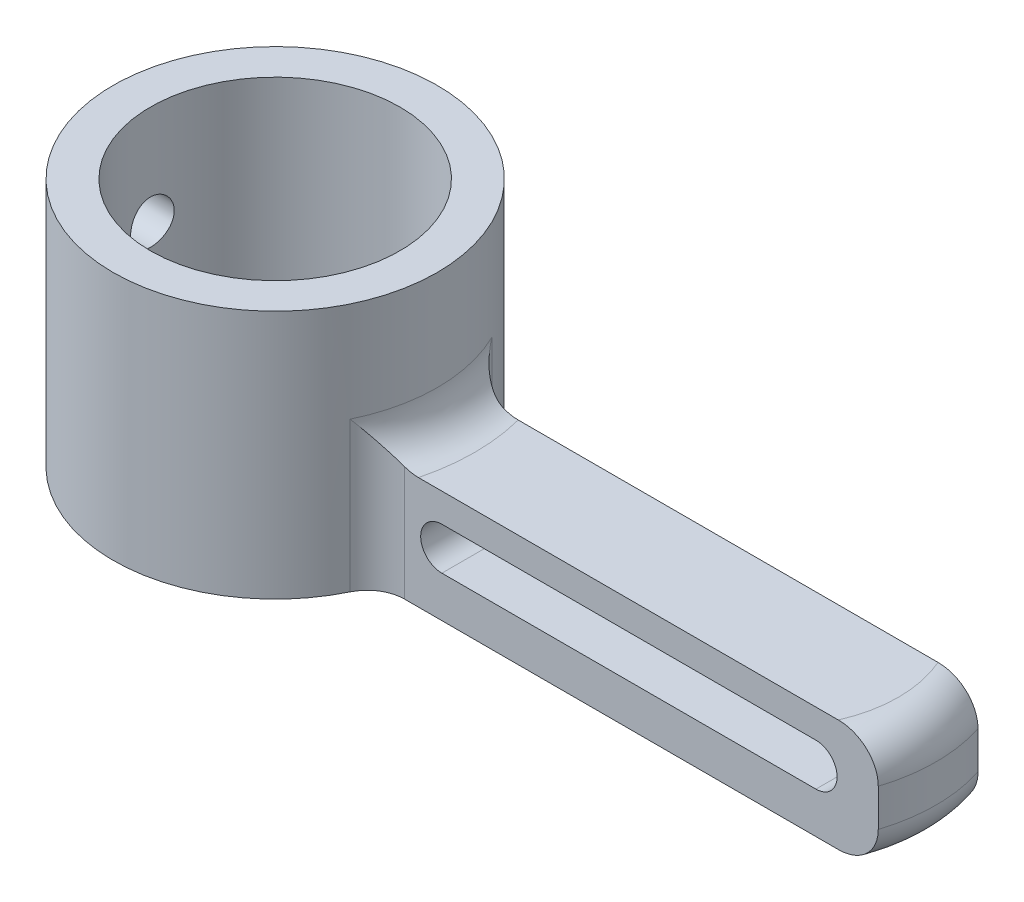
ISO-10303-21;
HEADER;
FILE_DESCRIPTION(('STEP AP214'),'2;1');
FILE_NAME('part.step','',(''),(''),'','','');
FILE_SCHEMA(('AUTOMOTIVE_DESIGN { 1 0 10303 214 1 1 1 1 }'));
ENDSEC;
DATA;
#1=APPLICATION_CONTEXT('core data for automotive mechanical design processes');
#2=APPLICATION_PROTOCOL_DEFINITION('international standard','automotive_design',2000,#1);
#3=PRODUCT_CONTEXT('',#1,'mechanical');
#4=PRODUCT('Part','Part','',(#3));
#5=PRODUCT_RELATED_PRODUCT_CATEGORY('part','',(#4));
#6=PRODUCT_DEFINITION_FORMATION('','',#4);
#7=PRODUCT_DEFINITION_CONTEXT('part definition',#1,'design');
#8=PRODUCT_DEFINITION('design','',#6,#7);
#9=PRODUCT_DEFINITION_SHAPE('','',#8);
#10=(LENGTH_UNIT() NAMED_UNIT(*) SI_UNIT(.MILLI.,.METRE.));
#11=(NAMED_UNIT(*) PLANE_ANGLE_UNIT() SI_UNIT($,.RADIAN.));
#12=(NAMED_UNIT(*) SI_UNIT($,.STERADIAN.) SOLID_ANGLE_UNIT());
#13=UNCERTAINTY_MEASURE_WITH_UNIT(LENGTH_MEASURE(1.E-05),#10,'distance_accuracy_value','');
#14=(GEOMETRIC_REPRESENTATION_CONTEXT(3) GLOBAL_UNCERTAINTY_ASSIGNED_CONTEXT((#13)) GLOBAL_UNIT_ASSIGNED_CONTEXT((#10,
#11,#12)) REPRESENTATION_CONTEXT('',''));
#15=CARTESIAN_POINT('',(0.,0.,0.));
#16=DIRECTION('',(0.,0.,1.));
#17=DIRECTION('',(1.,0.,0.));
#18=AXIS2_PLACEMENT_3D('',#15,#16,#17);
#19=CARTESIAN_POINT('',(0.,20.,0.));
#20=DIRECTION('',(0.,1.,0.));
#21=DIRECTION('',(0.,0.,1.));
#22=AXIS2_PLACEMENT_3D('',#19,#20,#21);
#23=PLANE('',#22);
#24=CARTESIAN_POINT('',(0.,20.,0.));
#25=DIRECTION('',(0.,1.,0.));
#26=DIRECTION('',(0.,0.,1.));
#27=AXIS2_PLACEMENT_3D('',#24,#25,#26);
#28=CIRCLE('',#27,13.);
#29=CARTESIAN_POINT('',(0.,20.,13.));
#30=VERTEX_POINT('',#29);
#31=EDGE_CURVE('E200',#30,#30,#28,.T.);
#32=ORIENTED_EDGE('',*,*,#31,.T.);
#33=EDGE_LOOP('',(#32));
#34=FACE_BOUND('',#33,.T.);
#35=CARTESIAN_POINT('',(0.,20.,0.));
#36=DIRECTION('',(0.,1.,0.));
#37=DIRECTION('',(0.,0.,1.));
#38=AXIS2_PLACEMENT_3D('',#35,#36,#37);
#39=CIRCLE('',#38,10.);
#40=CARTESIAN_POINT('',(0.,20.,10.));
#41=VERTEX_POINT('',#40);
#42=EDGE_CURVE('E194',#41,#41,#39,.T.);
#43=ORIENTED_EDGE('',*,*,#42,.F.);
#44=EDGE_LOOP('',(#43));
#45=FACE_BOUND('',#44,.T.);
#46=ADVANCED_FACE('F36',(#34,#45),#23,.T.);
#47=CARTESIAN_POINT('',(0.,0.,0.));
#48=DIRECTION('',(0.,1.,0.));
#49=DIRECTION('',(0.,0.,1.));
#50=AXIS2_PLACEMENT_3D('',#47,#48,#49);
#51=PLANE('',#50);
#52=DIRECTION('',(1.,0.,0.));
#53=VECTOR('',#52,1.);
#54=CARTESIAN_POINT('',(12.369316876853,0.,-4.));
#55=LINE('',#54,#53);
#56=CARTESIAN_POINT('',(14.3874945699382,0.,-4.));
#57=VERTEX_POINT('',#56);
#58=CARTESIAN_POINT('',(49.1651513899117,0.,-4.));
#59=VERTEX_POINT('',#58);
#60=EDGE_CURVE('E184',#57,#59,#55,.T.);
#61=ORIENTED_EDGE('',*,*,#60,.T.);
#62=CARTESIAN_POINT('',(40.,0.,0.));
#63=DIRECTION('',(0.,1.,0.));
#64=DIRECTION('',(0.,0.,1.));
#65=AXIS2_PLACEMENT_3D('',#62,#63,#64);
#66=CIRCLE('',#65,10.);
#67=CARTESIAN_POINT('',(49.1651513899117,0.,4.));
#68=VERTEX_POINT('',#67);
#69=EDGE_CURVE('E397',#59,#68,#66,.F.);
#70=ORIENTED_EDGE('',*,*,#69,.T.);
#71=DIRECTION('',(1.,0.,0.));
#72=VECTOR('',#71,1.);
#73=CARTESIAN_POINT('',(12.369316876853,0.,4.));
#74=LINE('',#73,#72);
#75=CARTESIAN_POINT('',(14.3874945699382,0.,4.));
#76=VERTEX_POINT('',#75);
#77=EDGE_CURVE('E180',#76,#68,#74,.T.);
#78=ORIENTED_EDGE('',*,*,#77,.F.);
#79=CARTESIAN_POINT('',(14.3874945699382,0.,7.));
#80=DIRECTION('',(0.,1.,0.));
#81=DIRECTION('',(0.,0.,1.));
#82=AXIS2_PLACEMENT_3D('',#79,#80,#81);
#83=CIRCLE('',#82,3.);
#84=CARTESIAN_POINT('',(11.6898393380748,0.,5.6875));
#85=VERTEX_POINT('',#84);
#86=EDGE_CURVE('E358',#76,#85,#83,.T.);
#87=ORIENTED_EDGE('',*,*,#86,.T.);
#88=CARTESIAN_POINT('',(0.,0.,0.));
#89=DIRECTION('',(0.,1.,0.));
#90=DIRECTION('',(0.,0.,1.));
#91=AXIS2_PLACEMENT_3D('',#88,#89,#90);
#92=CIRCLE('',#91,13.);
#93=CARTESIAN_POINT('',(11.6898393380747,0.,-5.68750000000001));
#94=VERTEX_POINT('',#93);
#95=EDGE_CURVE('E197',#94,#85,#92,.T.);
#96=ORIENTED_EDGE('',*,*,#95,.F.);
#97=CARTESIAN_POINT('',(14.3874945699382,0.,-7.00000000000001));
#98=DIRECTION('',(0.,1.,0.));
#99=DIRECTION('',(0.,0.,1.));
#100=AXIS2_PLACEMENT_3D('',#97,#98,#99);
#101=CIRCLE('',#100,3.);
#102=EDGE_CURVE('E360',#94,#57,#101,.T.);
#103=ORIENTED_EDGE('',*,*,#102,.T.);
#104=EDGE_LOOP('',(#61,#70,#78,#87,#96,#103));
#105=FACE_BOUND('',#104,.T.);
#106=CARTESIAN_POINT('',(0.,0.,0.));
#107=DIRECTION('',(0.,1.,0.));
#108=DIRECTION('',(0.,0.,1.));
#109=AXIS2_PLACEMENT_3D('',#106,#107,#108);
#110=CIRCLE('',#109,10.);
#111=CARTESIAN_POINT('',(0.,0.,10.));
#112=VERTEX_POINT('',#111);
#113=EDGE_CURVE('E179',#112,#112,#110,.T.);
#114=ORIENTED_EDGE('',*,*,#113,.T.);
#115=EDGE_LOOP('',(#114));
#116=FACE_BOUND('',#115,.T.);
#117=ADVANCED_FACE('F324',(#105,#116),#51,.F.);
#118=CARTESIAN_POINT('',(0.,20.,0.));
#119=DIRECTION('',(0.,-1.,0.));
#120=DIRECTION('',(0.,0.,-1.));
#121=AXIS2_PLACEMENT_3D('',#118,#119,#120);
#122=CYLINDRICAL_SURFACE('',#121,13.);
#123=CARTESIAN_POINT('',(-13.,10.25,0.));
#124=CARTESIAN_POINT('',(-12.9999985521372,10.25000411475,-0.0978237979660884));
#125=CARTESIAN_POINT('',(-12.9988841984544,10.2582300943909,-0.195707142021834));
#126=CARTESIAN_POINT('',(-12.994546029488,10.2909127668073,-0.388745625106214));
#127=CARTESIAN_POINT('',(-12.9913200656163,10.3153859917067,-0.483897882172419));
#128=CARTESIAN_POINT('',(-12.9831217731947,10.3798252335431,-0.668651970746064));
#129=CARTESIAN_POINT('',(-12.9781506731885,10.419780353559,-0.758257654872876));
#130=CARTESIAN_POINT('',(-12.9670136894873,10.5140243152595,-0.929476385369897));
#131=CARTESIAN_POINT('',(-12.9608479965122,10.5683108693944,-1.01109070445541));
#132=CARTESIAN_POINT('',(-12.9479654685375,10.6900445208605,-1.16454371648886));
#133=CARTESIAN_POINT('',(-12.9412457070711,10.7575644857055,-1.23632436423494));
#134=CARTESIAN_POINT('',(-12.9280357423664,10.9036916847126,-1.36757219662447));
#135=CARTESIAN_POINT('',(-12.9215455513677,10.9822995089112,-1.4270387255604));
#136=CARTESIAN_POINT('',(-12.9095009656507,11.1487531454775,-1.53219022157256));
#137=CARTESIAN_POINT('',(-12.9039503473239,11.2366340356987,-1.57782013072285));
#138=CARTESIAN_POINT('',(-12.894452540547,11.4188989498758,-1.65365142991599));
#139=CARTESIAN_POINT('',(-12.8905052817282,11.5132826882197,-1.68385349707652));
#140=CARTESIAN_POINT('',(-12.8846894202808,11.7052684469227,-1.72779390992671));
#141=CARTESIAN_POINT('',(-12.8828083796167,11.8028475277262,-1.74163080833544));
#142=CARTESIAN_POINT('',(-12.881299997981,11.9989594588543,-1.75275319024152));
#143=CARTESIAN_POINT('',(-12.8816725523552,12.0974922646768,-1.75003944233126));
#144=CARTESIAN_POINT('',(-12.8846178852364,12.2920244517767,-1.72821833150332));
#145=CARTESIAN_POINT('',(-12.8871760350663,12.3880363122558,-1.70921996242376));
#146=CARTESIAN_POINT('',(-12.8941814938275,12.5754967789111,-1.65553916450619));
#147=CARTESIAN_POINT('',(-12.8986288465938,12.6669452791492,-1.62085637174301));
#148=CARTESIAN_POINT('',(-12.9089280425316,12.843019198772,-1.53667547682536));
#149=CARTESIAN_POINT('',(-12.9147843226026,12.927621912081,-1.48713044734398));
#150=CARTESIAN_POINT('',(-12.9272381767187,13.0873537327713,-1.37466499446616));
#151=CARTESIAN_POINT('',(-12.9338357900394,13.1624823377703,-1.31174386225161));
#152=CARTESIAN_POINT('',(-12.9470938201609,13.3017656139645,-1.17371034926314));
#153=CARTESIAN_POINT('',(-12.9537543157621,13.3658272942741,-1.09850410625868));
#154=CARTESIAN_POINT('',(-12.9663382012047,13.4804327227095,-0.938357183992019));
#155=CARTESIAN_POINT('',(-12.9722615888507,13.5309764305702,-0.853416475735526));
#156=CARTESIAN_POINT('',(-12.9827083911439,13.6171129376177,-0.676136835210853));
#157=CARTESIAN_POINT('',(-12.987231214391,13.6526994232515,-0.583794798330787));
#158=CARTESIAN_POINT('',(-12.9943621026477,13.7078349523992,-0.394371194843379));
#159=CARTESIAN_POINT('',(-12.9969702717216,13.7273848675323,-0.297289886128725));
#160=CARTESIAN_POINT('',(-12.9999643645727,13.7497706458109,-0.101947026229368));
#161=CARTESIAN_POINT('',(-13.0003673069704,13.7527345141634,-0.00370039492049359));
#162=CARTESIAN_POINT('',(-12.9989516326924,13.7422025848844,0.19188826307036));
#163=CARTESIAN_POINT('',(-12.9971330710807,13.7287071952249,0.289230312113765));
#164=CARTESIAN_POINT('',(-12.9914892870012,13.6857462190778,0.479865271203644));
#165=CARTESIAN_POINT('',(-12.987671796197,13.6563421513369,0.57317229338421));
#166=CARTESIAN_POINT('',(-12.978457245473,13.5824627835465,0.753531363748753));
#167=CARTESIAN_POINT('',(-12.9730601242438,13.5379868985109,0.840583168988449));
#168=CARTESIAN_POINT('',(-12.9612448826954,13.4349201254343,1.00652921578123));
#169=CARTESIAN_POINT('',(-12.954820891817,13.3762470167264,1.08537196588193));
#170=CARTESIAN_POINT('',(-12.9416876203555,13.2465669522004,1.23213680097962));
#171=CARTESIAN_POINT('',(-12.9349783265703,13.1755594251522,1.30005837991595));
#172=CARTESIAN_POINT('',(-12.921977582418,13.0226600767028,1.42351123244924));
#173=CARTESIAN_POINT('',(-12.9156892000908,12.940699158419,1.47895729879658));
#174=CARTESIAN_POINT('',(-12.9042941715955,12.7685525211427,1.5752952604964));
#175=CARTESIAN_POINT('',(-12.8991874986188,12.6783669888017,1.61618748603419));
#176=CARTESIAN_POINT('',(-12.8907555028582,12.4925984868317,1.68212116296917));
#177=CARTESIAN_POINT('',(-12.8874249169362,12.3970324026658,1.70720948710295));
#178=CARTESIAN_POINT('',(-12.88290751772,12.2029957401826,1.74097354572996));
#179=CARTESIAN_POINT('',(-12.8817205873582,12.1045253207732,1.74965017648698));
#180=CARTESIAN_POINT('',(-12.8816286608549,11.9083234211789,1.7503263276244));
#181=CARTESIAN_POINT('',(-12.8827053438472,11.8105923842309,1.74245974265691));
#182=CARTESIAN_POINT('',(-12.8869797859319,11.6178556311619,1.7105575363172));
#183=CARTESIAN_POINT('',(-12.8901775440565,11.5228499137975,1.68652192232225));
#184=CARTESIAN_POINT('',(-12.898327893981,11.3382854228301,1.6230078448862));
#185=CARTESIAN_POINT('',(-12.9032796311822,11.2487240214242,1.58353690109388));
#186=CARTESIAN_POINT('',(-12.9143812669821,11.0774736487548,1.49028576144241));
#187=CARTESIAN_POINT('',(-12.9205311900012,10.9957848379936,1.43650527393169));
#188=CARTESIAN_POINT('',(-12.9333957770234,10.8419154306854,1.31566849308606));
#189=CARTESIAN_POINT('',(-12.9401144464454,10.7698133846122,1.2485125939767));
#190=CARTESIAN_POINT('',(-12.953324821698,10.6378523124444,1.10304069306349));
#191=CARTESIAN_POINT('',(-12.9598164739566,10.5779961602162,1.02472207889356));
#192=CARTESIAN_POINT('',(-12.9718734323741,10.471996801296,0.858747773971037));
#193=CARTESIAN_POINT('',(-12.9774345330208,10.4259151470044,0.77105248194295));
#194=CARTESIAN_POINT('',(-12.9869618472416,10.3492004597927,0.589138932352447));
#195=CARTESIAN_POINT('',(-12.9909297635585,10.318550924584,0.494927765705065));
#196=CARTESIAN_POINT('',(-12.9958854401961,10.2807687401952,0.333543153226379));
#197=CARTESIAN_POINT('',(-12.9974207365839,10.269247421566,0.267380094751168));
#198=CARTESIAN_POINT('',(-12.999478508394,10.2538616751449,0.134154021642384));
#199=CARTESIAN_POINT('',(-13.0000009929955,10.2499971779591,0.0670910151705982));
#200=CARTESIAN_POINT('',(-13.,10.25,0.));
#201=B_SPLINE_CURVE_WITH_KNOTS('',3,(#123,#124,#125,#126,#127,#128,#129,#130,#131,#132,#133,
#134,#135,#136,#137,#138,#139,#140,#141,#142,#143,#144,#145,#146,#147,#148,#149,#150,#151,#152,
#153,#154,#155,#156,#157,#158,#159,#160,#161,#162,#163,#164,#165,#166,#167,#168,#169,#170,#171,
#172,#173,#174,#175,#176,#177,#178,#179,#180,#181,#182,#183,#184,#185,#186,#187,#188,#189,#190,
#191,#192,#193,#194,#195,#196,#197,#198,#199,#200),.UNSPECIFIED.,.T.,.F.,(4,2,2,2,2,2,2,2,2,2,2,
2,2,2,2,2,2,2,2,2,2,2,2,2,2,2,2,2,2,2,2,2,2,2,2,2,2,2,4),(0.,0.29322629777332,0.586751421514244,
0.880070321982425,1.17334243185543,1.46827721894938,1.76322770682219,2.05933689333256,
2.35543308269191,2.64973692124041,2.94402709277175,3.23636280881754,3.52870530826744,
3.82198076941684,4.11527177551277,4.41091853050476,4.70656616610914,5.00233847171726,
5.29809470045182,5.59156520659989,5.88502843870561,6.17736487801722,6.46971266515618,
6.76379585384255,7.05789266570824,7.35394097469031,7.64998256674895,7.94514194407044,
8.2402852018913,8.53304887675177,8.82581241803648,9.11843351066956,9.41106056784947,
9.70595427281151,10.0009171042436,10.297178945049,10.5931233027335,10.7942300753095,
10.9953350252436),.UNSPECIFIED.);
#202=CARTESIAN_POINT('',(-13.,10.25,0.));
#203=VERTEX_POINT('',#202);
#204=EDGE_CURVE('E286',#203,#203,#201,.T.);
#205=ORIENTED_EDGE('',*,*,#204,.T.);
#206=EDGE_LOOP('',(#205));
#207=FACE_BOUND('',#206,.T.);
#208=ORIENTED_EDGE('',*,*,#95,.T.);
#209=DIRECTION('',(0.,-1.,0.));
#210=VECTOR('',#209,1.);
#211=CARTESIAN_POINT('',(11.6898393380748,20.,5.6875));
#212=LINE('',#211,#210);
#213=CARTESIAN_POINT('',(11.6898393380748,12.,5.6875));
#214=VERTEX_POINT('',#213);
#215=EDGE_CURVE('E354',#85,#214,#212,.F.);
#216=ORIENTED_EDGE('',*,*,#215,.T.);
#217=CARTESIAN_POINT('',(0.,12.,0.));
#218=DIRECTION('',(0.,1.,0.));
#219=DIRECTION('',(0.,0.,1.));
#220=AXIS2_PLACEMENT_3D('',#217,#218,#219);
#221=CIRCLE('',#220,13.);
#222=CARTESIAN_POINT('',(11.6898393380747,12.,-5.68750000000001));
#223=VERTEX_POINT('',#222);
#224=EDGE_CURVE('E362',#214,#223,#221,.T.);
#225=ORIENTED_EDGE('',*,*,#224,.T.);
#226=DIRECTION('',(0.,-1.,0.));
#227=VECTOR('',#226,1.);
#228=CARTESIAN_POINT('',(11.6898393380747,20.,-5.68750000000001));
#229=LINE('',#228,#227);
#230=EDGE_CURVE('E356',#223,#94,#229,.T.);
#231=ORIENTED_EDGE('',*,*,#230,.T.);
#232=EDGE_LOOP('',(#208,#216,#225,#231));
#233=FACE_BOUND('',#232,.T.);
#234=ORIENTED_EDGE('',*,*,#31,.F.);
#235=EDGE_LOOP('',(#234));
#236=FACE_BOUND('',#235,.T.);
#237=ADVANCED_FACE('F298',(#207,#233,#236),#122,.T.);
#238=CARTESIAN_POINT('',(0.,20.,0.));
#239=DIRECTION('',(0.,-1.,0.));
#240=DIRECTION('',(0.,0.,-1.));
#241=AXIS2_PLACEMENT_3D('',#238,#239,#240);
#242=CYLINDRICAL_SURFACE('',#241,10.);
#243=CARTESIAN_POINT('',(-9.84568433375761,12.,-1.75));
#244=CARTESIAN_POINT('',(-9.84568614971877,12.0974873325948,-1.74999614707769));
#245=CARTESIAN_POINT('',(-9.84714794833416,12.1950260835086,-1.7418262952061));
#246=CARTESIAN_POINT('',(-9.8528311213324,12.3873615772936,-1.7093799629126));
#247=CARTESIAN_POINT('',(-9.85705496167591,12.4821557907809,-1.68508908929617));
#248=CARTESIAN_POINT('',(-9.86776951325615,12.6661910931974,-1.62116248086999));
#249=CARTESIAN_POINT('',(-9.87425824580223,12.7554369494513,-1.58154013691065));
#250=CARTESIAN_POINT('',(-9.88876912660767,12.9260061566072,-1.48810953050795));
#251=CARTESIAN_POINT('',(-9.89679112283797,13.0073302917727,-1.43430267431371));
#252=CARTESIAN_POINT('',(-9.91356194372765,13.1606386550872,-1.31340755862099));
#253=CARTESIAN_POINT('',(-9.92231707580156,13.2325244054908,-1.24619527573238));
#254=CARTESIAN_POINT('',(-9.93951178241083,13.3640590399093,-1.10066526787948));
#255=CARTESIAN_POINT('',(-9.94795133745731,13.4237071691905,-1.0223468584679));
#256=CARTESIAN_POINT('',(-9.96363106264343,13.5294460471802,-0.856186208091839));
#257=CARTESIAN_POINT('',(-9.97086294471024,13.5754446695992,-0.768284492208794));
#258=CARTESIAN_POINT('',(-9.98324213395081,13.6519861177161,-0.585853799604156));
#259=CARTESIAN_POINT('',(-9.98838959044574,13.6825300505745,-0.491325298172316));
#260=CARTESIAN_POINT('',(-9.99597541274984,13.7269925772789,-0.299343066316542));
#261=CARTESIAN_POINT('',(-9.99844076058662,13.7410768641537,-0.201928793544092));
#262=CARTESIAN_POINT('',(-10.0004774070068,13.7527359347423,-0.00609074034883461));
#263=CARTESIAN_POINT('',(-10.0000489215371,13.7503119503546,0.0923329641997542));
#264=CARTESIAN_POINT('',(-9.99636743323528,13.7291516761602,0.286261787878407));
#265=CARTESIAN_POINT('',(-9.99314531364367,13.7105937388813,0.381787038143539));
#266=CARTESIAN_POINT('',(-9.98427309789633,13.6579736700197,0.568346432353335));
#267=CARTESIAN_POINT('',(-9.9786229219846,13.6239110291415,0.659380428661259));
#268=CARTESIAN_POINT('',(-9.96547722388571,13.5410740567072,0.83489854366497));
#269=CARTESIAN_POINT('',(-9.9579726245404,13.4922270850945,0.91934767181322));
#270=CARTESIAN_POINT('',(-9.9419503878988,13.3812613691628,1.07891760175991));
#271=CARTESIAN_POINT('',(-9.9334326604727,13.3191414436641,1.15403757240155));
#272=CARTESIAN_POINT('',(-9.91619557457141,13.1824063957037,1.29387175378861));
#273=CARTESIAN_POINT('',(-9.9074750428737,13.1076353242685,1.35843341984165));
#274=CARTESIAN_POINT('',(-9.89092484526781,12.948243593407,1.47412052948707));
#275=CARTESIAN_POINT('',(-9.88309518929719,12.8636228241303,1.52524582320742));
#276=CARTESIAN_POINT('',(-9.86921219314739,12.6867471042259,1.61264408867291));
#277=CARTESIAN_POINT('',(-9.86316122762236,12.5944821568138,1.64889723053681));
#278=CARTESIAN_POINT('',(-9.85355879963018,12.4050420370526,1.70534655701126));
#279=CARTESIAN_POINT('',(-9.85000709296117,12.307867345428,1.72554431041425));
#280=CARTESIAN_POINT('',(-9.84585299926953,12.1127351702276,1.74909167072955));
#281=CARTESIAN_POINT('',(-9.84521243389554,12.0148047945409,1.75265938935999));
#282=CARTESIAN_POINT('',(-9.84685127712912,11.8197468062551,1.74342797042691));
#283=CARTESIAN_POINT('',(-9.84913056083862,11.7226191594978,1.73062953293436));
#284=CARTESIAN_POINT('',(-9.85631689910622,11.5326258909547,1.68921556854974));
#285=CARTESIAN_POINT('',(-9.86120528899016,11.4397350215464,1.66071234224035));
#286=CARTESIAN_POINT('',(-9.87304321959131,11.2600480012619,1.58881621009288));
#287=CARTESIAN_POINT('',(-9.87999289484608,11.173252248664,1.54542233233126));
#288=CARTESIAN_POINT('',(-9.89525837117709,11.0072523468152,1.44446686852146));
#289=CARTESIAN_POINT('',(-9.90358729231133,10.9281339641645,1.38676627772465));
#290=CARTESIAN_POINT('',(-9.92063500418771,10.7806240891405,1.25902478392813));
#291=CARTESIAN_POINT('',(-9.9293538252426,10.7122334326635,1.18898292020779));
#292=CARTESIAN_POINT('',(-9.94632045663045,10.5873168099732,1.03757773333283));
#293=CARTESIAN_POINT('',(-9.95456167481406,10.5309367817104,0.956093151851282));
#294=CARTESIAN_POINT('',(-9.96953684410524,10.43266703399,0.784682023768008));
#295=CARTESIAN_POINT('',(-9.97627084771867,10.3907768097326,0.694755771398281));
#296=CARTESIAN_POINT('',(-9.98744431327328,10.3228995618174,0.509435756884873));
#297=CARTESIAN_POINT('',(-9.99189451501047,10.2968379941339,0.414069973569285));
#298=CARTESIAN_POINT('',(-9.99804452672039,10.2611185879911,0.220230515016627));
#299=CARTESIAN_POINT('',(-9.99974458725255,10.2514592551555,0.121757123740522));
#300=CARTESIAN_POINT('',(-10.0001986676664,10.2488650121166,-0.0740972279384982));
#301=CARTESIAN_POINT('',(-9.9989916888787,10.2557086961367,-0.17147523552859));
#302=CARTESIAN_POINT('',(-9.99384747273867,10.2854450017052,-0.363671714431676));
#303=CARTESIAN_POINT('',(-9.98991025464597,10.3083375100424,-0.458490203795065));
#304=CARTESIAN_POINT('',(-9.97974688526101,10.3694333731408,-0.642778931888432));
#305=CARTESIAN_POINT('',(-9.97352382539292,10.407616055386,-0.732256205080809));
#306=CARTESIAN_POINT('',(-9.95946589247331,10.4981830641747,-0.903568024982699));
#307=CARTESIAN_POINT('',(-9.95163093054382,10.5505681738704,-0.985402149898064));
#308=CARTESIAN_POINT('',(-9.93509204541497,10.6688291884363,-1.14021551395227));
#309=CARTESIAN_POINT('',(-9.9263784362471,10.7348664152033,-1.21307049932053));
#310=CARTESIAN_POINT('',(-9.90912905327679,10.8782198114778,-1.34674250927088));
#311=CARTESIAN_POINT('',(-9.90059332163407,10.9555386209168,-1.40755670839287));
#312=CARTESIAN_POINT('',(-9.88459302297716,11.1199876867748,-1.51586622368385));
#313=CARTESIAN_POINT('',(-9.87713744439717,11.2071905819914,-1.56325260200568));
#314=CARTESIAN_POINT('',(-9.86424848595999,11.3884168686292,-1.64262974084897));
#315=CARTESIAN_POINT('',(-9.8588131298501,11.4824334864395,-1.6746355562061));
#316=CARTESIAN_POINT('',(-9.85175783194062,11.6473194661977,-1.71556325785051));
#317=CARTESIAN_POINT('',(-9.84949326196896,11.7172025379643,-1.72845578041526));
#318=CARTESIAN_POINT('',(-9.84645586764426,11.8580480001092,-1.74567546273085));
#319=CARTESIAN_POINT('',(-9.84568301138667,11.9290103673708,-1.75000280567262));
#320=CARTESIAN_POINT('',(-9.84568433375761,12.,-1.75));
#321=B_SPLINE_CURVE_WITH_KNOTS('',3,(#243,#244,#245,#246,#247,#248,#249,#250,#251,#252,#253,
#254,#255,#256,#257,#258,#259,#260,#261,#262,#263,#264,#265,#266,#267,#268,#269,#270,#271,#272,
#273,#274,#275,#276,#277,#278,#279,#280,#281,#282,#283,#284,#285,#286,#287,#288,#289,#290,#291,
#292,#293,#294,#295,#296,#297,#298,#299,#300,#301,#302,#303,#304,#305,#306,#307,#308,#309,#310,
#311,#312,#313,#314,#315,#316,#317,#318,#319,#320),.UNSPECIFIED.,.T.,.F.,(4,2,2,2,2,2,2,2,2,2,2,
2,2,2,2,2,2,2,2,2,2,2,2,2,2,2,2,2,2,2,2,2,2,2,2,2,2,2,4),(0.,0.292202329923689,
0.584665895961619,0.876874592267835,1.16905432996191,1.4640743349544,1.75911252931879,
2.05609898984408,2.3530641715019,2.6470134393541,2.94094077204019,3.2316596197882,
3.52238801770299,3.8145687056272,4.10677540597687,4.40288870912172,4.69900531503459,
4.99551547662587,5.29199666226917,5.58457818931964,5.87714720145928,6.16765078589468,
6.45817333531593,6.75163754038525,7.04512460061544,7.34199657440749,7.63885820465188,
7.93431071913839,8.22973631406723,8.5212205564001,8.81270274257226,9.10379216440069,
9.3948976407859,9.68966278421802,9.98449701472035,10.2816588511069,10.5785292234368,
10.7913135839539,11.004093393418),.UNSPECIFIED.);
#322=CARTESIAN_POINT('',(-9.84568433375761,12.,-1.75));
#323=VERTEX_POINT('',#322);
#324=EDGE_CURVE('E41',#323,#323,#321,.T.);
#325=ORIENTED_EDGE('',*,*,#324,.F.);
#326=EDGE_LOOP('',(#325));
#327=FACE_BOUND('',#326,.T.);
#328=ORIENTED_EDGE('',*,*,#42,.T.);
#329=EDGE_LOOP('',(#328));
#330=FACE_BOUND('',#329,.T.);
#331=ORIENTED_EDGE('',*,*,#113,.F.);
#332=EDGE_LOOP('',(#331));
#333=FACE_BOUND('',#332,.T.);
#334=ADVANCED_FACE('F246',(#327,#330,#333),#242,.F.);
#335=CARTESIAN_POINT('',(40.,20.,0.));
#336=DIRECTION('',(0.,-1.,0.));
#337=DIRECTION('',(0.,0.,-1.));
#338=AXIS2_PLACEMENT_3D('',#335,#336,#337);
#339=CYLINDRICAL_SURFACE('',#338,13.);
#340=DIRECTION('',(0.,-1.,0.));
#341=VECTOR('',#340,1.);
#342=CARTESIAN_POINT('',(52.369316876853,20.,4.));
#343=LINE('',#342,#341);
#344=CARTESIAN_POINT('',(52.369316876853,6.,4.));
#345=VERTEX_POINT('',#344);
#346=CARTESIAN_POINT('',(52.369316876853,3.,4.));
#347=VERTEX_POINT('',#346);
#348=EDGE_CURVE('E176',#345,#347,#343,.T.);
#349=ORIENTED_EDGE('',*,*,#348,.T.);
#350=CARTESIAN_POINT('',(40.,3.,0.));
#351=DIRECTION('',(0.,1.,0.));
#352=DIRECTION('',(0.,0.,1.));
#353=AXIS2_PLACEMENT_3D('',#350,#351,#352);
#354=CIRCLE('',#353,13.);
#355=CARTESIAN_POINT('',(52.369316876853,3.,-4.00000000000001));
#356=VERTEX_POINT('',#355);
#357=EDGE_CURVE('E217',#347,#356,#354,.T.);
#358=ORIENTED_EDGE('',*,*,#357,.T.);
#359=DIRECTION('',(0.,-1.,0.));
#360=VECTOR('',#359,1.);
#361=CARTESIAN_POINT('',(52.369316876853,20.,-4.00000000000001));
#362=LINE('',#361,#360);
#363=CARTESIAN_POINT('',(52.369316876853,6.,-4.00000000000001));
#364=VERTEX_POINT('',#363);
#365=EDGE_CURVE('E181',#364,#356,#362,.T.);
#366=ORIENTED_EDGE('',*,*,#365,.F.);
#367=CARTESIAN_POINT('',(40.,6.,0.));
#368=DIRECTION('',(0.,1.,0.));
#369=DIRECTION('',(0.,0.,1.));
#370=AXIS2_PLACEMENT_3D('',#367,#368,#369);
#371=CIRCLE('',#370,13.);
#372=EDGE_CURVE('E214',#364,#345,#371,.F.);
#373=ORIENTED_EDGE('',*,*,#372,.T.);
#374=EDGE_LOOP('',(#349,#358,#366,#373));
#375=FACE_BOUND('',#374,.T.);
#376=ADVANCED_FACE('F317',(#375),#339,.T.);
#377=CARTESIAN_POINT('',(12.369316876853,9.,4.));
#378=DIRECTION('',(0.,1.,0.));
#379=DIRECTION('',(0.,0.,1.));
#380=AXIS2_PLACEMENT_3D('',#377,#378,#379);
#381=PLANE('',#380);
#382=DIRECTION('',(1.,0.,0.));
#383=VECTOR('',#382,1.);
#384=CARTESIAN_POINT('',(12.369316876853,9.,4.));
#385=LINE('',#384,#383);
#386=CARTESIAN_POINT('',(15.4919333848297,9.,4.));
#387=VERTEX_POINT('',#386);
#388=CARTESIAN_POINT('',(49.1651513899117,9.,4.));
#389=VERTEX_POINT('',#388);
#390=EDGE_CURVE('E173',#387,#389,#385,.T.);
#391=ORIENTED_EDGE('',*,*,#390,.T.);
#392=CARTESIAN_POINT('',(40.,9.,0.));
#393=DIRECTION('',(0.,1.,0.));
#394=DIRECTION('',(0.,0.,1.));
#395=AXIS2_PLACEMENT_3D('',#392,#393,#394);
#396=CIRCLE('',#395,10.);
#397=CARTESIAN_POINT('',(49.1651513899117,9.,-4.00000000000001));
#398=VERTEX_POINT('',#397);
#399=EDGE_CURVE('E369',#389,#398,#396,.T.);
#400=ORIENTED_EDGE('',*,*,#399,.T.);
#401=DIRECTION('',(1.,0.,0.));
#402=VECTOR('',#401,1.);
#403=CARTESIAN_POINT('',(12.369316876853,9.,-4.00000000000001));
#404=LINE('',#403,#402);
#405=CARTESIAN_POINT('',(15.4919333848297,9.,-4.00000000000001));
#406=VERTEX_POINT('',#405);
#407=EDGE_CURVE('E185',#406,#398,#404,.T.);
#408=ORIENTED_EDGE('',*,*,#407,.F.);
#409=CARTESIAN_POINT('',(0.,9.,0.));
#410=DIRECTION('',(0.,1.,0.));
#411=DIRECTION('',(0.,0.,1.));
#412=AXIS2_PLACEMENT_3D('',#409,#410,#411);
#413=CIRCLE('',#412,16.);
#414=EDGE_CURVE('E370',#406,#387,#413,.F.);
#415=ORIENTED_EDGE('',*,*,#414,.T.);
#416=EDGE_LOOP('',(#391,#400,#408,#415));
#417=FACE_BOUND('',#416,.T.);
#418=ADVANCED_FACE('F247',(#417),#381,.T.);
#419=CARTESIAN_POINT('',(12.369316876853,20.,4.));
#420=DIRECTION('',(0.,0.,1.));
#421=DIRECTION('',(1.,0.,0.));
#422=AXIS2_PLACEMENT_3D('',#419,#420,#421);
#423=PLANE('',#422);
#424=CARTESIAN_POINT('',(17.369316876853,5.,4.));
#425=DIRECTION('',(0.,0.,1.));
#426=DIRECTION('',(1.,0.,0.));
#427=AXIS2_PLACEMENT_3D('',#424,#425,#426);
#428=CIRCLE('',#427,1.7);
#429=CARTESIAN_POINT('',(17.369316876853,6.7,4.));
#430=VERTEX_POINT('',#429);
#431=CARTESIAN_POINT('',(17.369316876853,3.3,4.));
#432=VERTEX_POINT('',#431);
#433=EDGE_CURVE('E161',#430,#432,#428,.T.);
#434=ORIENTED_EDGE('',*,*,#433,.F.);
#435=DIRECTION('',(-1.,0.,0.));
#436=VECTOR('',#435,1.);
#437=CARTESIAN_POINT('',(17.369316876853,6.7,4.));
#438=LINE('',#437,#436);
#439=CARTESIAN_POINT('',(47.369316876853,6.7,4.));
#440=VERTEX_POINT('',#439);
#441=EDGE_CURVE('E166',#440,#430,#438,.T.);
#442=ORIENTED_EDGE('',*,*,#441,.F.);
#443=CARTESIAN_POINT('',(47.369316876853,5.,4.));
#444=DIRECTION('',(0.,0.,1.));
#445=DIRECTION('',(1.,0.,0.));
#446=AXIS2_PLACEMENT_3D('',#443,#444,#445);
#447=CIRCLE('',#446,1.7);
#448=CARTESIAN_POINT('',(47.369316876853,3.3,4.));
#449=VERTEX_POINT('',#448);
#450=EDGE_CURVE('E145',#449,#440,#447,.T.);
#451=ORIENTED_EDGE('',*,*,#450,.F.);
#452=DIRECTION('',(1.,0.,0.));
#453=VECTOR('',#452,1.);
#454=CARTESIAN_POINT('',(17.369316876853,3.3,4.));
#455=LINE('',#454,#453);
#456=EDGE_CURVE('E156',#432,#449,#455,.T.);
#457=ORIENTED_EDGE('',*,*,#456,.F.);
#458=EDGE_LOOP('',(#434,#442,#451,#457));
#459=FACE_BOUND('',#458,.T.);
#460=ORIENTED_EDGE('',*,*,#77,.T.);
#461=CARTESIAN_POINT('',(49.1651513899117,0.,4.));
#462=CARTESIAN_POINT('',(49.2608039171511,-6.14389760929141E-06,4.));
#463=CARTESIAN_POINT('',(49.3564635637027,0.0038430732599586,4.));
#464=CARTESIAN_POINT('',(49.5471789117733,0.0193242833762691,4.));
#465=CARTESIAN_POINT('',(49.6422344188482,0.0309586654865036,4.));
#466=CARTESIAN_POINT('',(49.8312912901346,0.0621198496200538,4.));
#467=CARTESIAN_POINT('',(49.925289562131,0.0816656029310256,4.));
#468=CARTESIAN_POINT('',(50.1112602678016,0.128633414275005,4.));
#469=CARTESIAN_POINT('',(50.2032329095299,0.15605465930978,4.));
#470=CARTESIAN_POINT('',(50.4754966132167,0.250250454370082,4.));
#471=CARTESIAN_POINT('',(50.6518609133177,0.328912818384001,4.));
#472=CARTESIAN_POINT('',(50.9874185549584,0.516415565084651,4.));
#473=CARTESIAN_POINT('',(51.146634524112,0.625215485885446,4.));
#474=CARTESIAN_POINT('',(51.4336295781511,0.863271400167813,4.));
#475=CARTESIAN_POINT('',(51.5626987720209,0.990968870411795,4.));
#476=CARTESIAN_POINT('',(51.7958806748261,1.267541380783,4.));
#477=CARTESIAN_POINT('',(51.8999900495718,1.41641924600804,4.));
#478=CARTESIAN_POINT('',(52.0735610571472,1.72102833942676,4.));
#479=CARTESIAN_POINT('',(52.1447634648407,1.87577071443149,4.));
#480=CARTESIAN_POINT('',(52.2588751832764,2.19524765213173,4.));
#481=CARTESIAN_POINT('',(52.3018250467717,2.35996752068461,4.));
#482=CARTESIAN_POINT('',(52.3430054176872,2.60519038093477,4.));
#483=CARTESIAN_POINT('',(52.3528709376709,2.6838917991156,4.));
#484=CARTESIAN_POINT('',(52.3660209043428,2.84171540607861,4.));
#485=CARTESIAN_POINT('',(52.3693158803733,2.92083671759585,4.));
#486=CARTESIAN_POINT('',(52.369316876853,3.,4.));
#487=B_SPLINE_CURVE_WITH_KNOTS('',3,(#461,#462,#463,#464,#465,#466,#467,#468,#469,#470,#471,
#472,#473,#474,#475,#476,#477,#478,#479,#480,#481,#482,#483,#484,#485,#486),.UNSPECIFIED.,.F.,
.F.,(4,2,2,2,2,2,2,2,2,2,2,2,4),(0.,0.28688911502633,0.573866312463274,0.861535056439304,
1.1491741146284,1.72526977885438,2.30059571009855,2.84244725500304,3.38437114139657,
3.89287467519934,4.40064671814334,4.6383661766609,4.87570438097207),.UNSPECIFIED.);
#488=EDGE_CURVE('E374',#68,#347,#487,.T.);
#489=ORIENTED_EDGE('',*,*,#488,.T.);
#490=ORIENTED_EDGE('',*,*,#348,.F.);
#491=CARTESIAN_POINT('',(52.369316876853,6.,4.));
#492=CARTESIAN_POINT('',(52.3693268523165,6.0812042340016,4.));
#493=CARTESIAN_POINT('',(52.3658518374112,6.16240370931147,4.));
#494=CARTESIAN_POINT('',(52.3520085966654,6.32420308911848,4.));
#495=CARTESIAN_POINT('',(52.341641230987,6.40480306716352,4.));
#496=CARTESIAN_POINT('',(52.3141160596505,6.56468271952144,4.));
#497=CARTESIAN_POINT('',(52.2969711253347,6.64396460135331,4.));
#498=CARTESIAN_POINT('',(52.2560578762044,6.80077777303337,4.));
#499=CARTESIAN_POINT('',(52.2322895483555,6.87830905943619,4.));
#500=CARTESIAN_POINT('',(52.1513159121104,7.10747687715289,4.));
#501=CARTESIAN_POINT('',(52.0844197414284,7.25581503671789,4.));
#502=CARTESIAN_POINT('',(51.9271066742539,7.53933392058256,4.));
#503=CARTESIAN_POINT('',(51.8366862923135,7.67451269104883,4.));
#504=CARTESIAN_POINT('',(51.6334583737089,7.93065247798575,4.));
#505=CARTESIAN_POINT('',(51.5202938848188,8.05133028478792,4.));
#506=CARTESIAN_POINT('',(51.2761086046798,8.27296181405263,4.));
#507=CARTESIAN_POINT('',(51.1450857342662,8.37391323653244,4.));
#508=CARTESIAN_POINT('',(50.8626198311376,8.55828836610187,4.));
#509=CARTESIAN_POINT('',(50.7105170621198,8.64069966640589,4.));
#510=CARTESIAN_POINT('',(50.3951713094355,8.7805505944481,4.));
#511=CARTESIAN_POINT('',(50.2319220574074,8.83797603501869,4.));
#512=CARTESIAN_POINT('',(49.9185729691122,8.9219215451937,4.));
#513=CARTESIAN_POINT('',(49.7692284844227,8.95131174085898,4.));
#514=CARTESIAN_POINT('',(49.4682888786518,8.99035316669289,4.));
#515=CARTESIAN_POINT('',(49.3166991165374,9.0000455419243,4.));
#516=CARTESIAN_POINT('',(49.1651513899117,9.,4.));
#517=B_SPLINE_CURVE_WITH_KNOTS('',3,(#491,#492,#493,#494,#495,#496,#497,#498,#499,#500,#501,
#502,#503,#504,#505,#506,#507,#508,#509,#510,#511,#512,#513,#514,#515,#516),.UNSPECIFIED.,.F.,
.F.,(4,2,2,2,2,2,2,2,2,2,2,2,4),(0.,0.243530063669263,0.487029740606573,0.730069189697787,
0.973109117078141,1.45880511716322,1.94457312107079,2.43866215314281,2.93280875882031,
3.44954809858414,3.9665804653207,4.42191817762104,4.87630379296792),.UNSPECIFIED.);
#518=EDGE_CURVE('E380',#345,#389,#517,.T.);
#519=ORIENTED_EDGE('',*,*,#518,.T.);
#520=ORIENTED_EDGE('',*,*,#390,.F.);
#521=CARTESIAN_POINT('',(15.4919333848297,9.,4.));
#522=CARTESIAN_POINT('',(15.3976106844292,8.99999148271775,4.));
#523=CARTESIAN_POINT('',(15.3032914600554,9.00417032318859,4.));
#524=CARTESIAN_POINT('',(15.1161044314035,9.02074528793584,4.));
#525=CARTESIAN_POINT('',(15.0232310436157,9.03307835849697,4.));
#526=CARTESIAN_POINT('',(14.8389198517472,9.0658069079184,4.));
#527=CARTESIAN_POINT('',(14.7474819907764,9.08620206643427,4.));
#528=CARTESIAN_POINT('',(14.566037868259,9.13507884989024,4.));
#529=CARTESIAN_POINT('',(14.4760480575241,9.16362154821134,4.));
#530=CARTESIAN_POINT('',(14.3874945699382,9.19609116799805,4.));
#531=B_SPLINE_CURVE_WITH_KNOTS('',3,(#521,#522,#523,#524,#525,#526,#527,#528,#529,#530),
.UNSPECIFIED.,.F.,.F.,(4,2,2,2,4),(0.,0.282870368441789,0.563578591065785,0.844275660960939,
1.12713470569206),.UNSPECIFIED.);
#532=CARTESIAN_POINT('',(14.3874945699382,9.19609116799805,4.));
#533=VERTEX_POINT('',#532);
#534=EDGE_CURVE('E51',#387,#533,#531,.T.);
#535=ORIENTED_EDGE('',*,*,#534,.T.);
#536=DIRECTION('',(0.,-1.,0.));
#537=VECTOR('',#536,1.);
#538=CARTESIAN_POINT('',(14.3874945699382,20.,4.));
#539=LINE('',#538,#537);
#540=EDGE_CURVE('E66',#533,#76,#539,.T.);
#541=ORIENTED_EDGE('',*,*,#540,.T.);
#542=EDGE_LOOP('',(#460,#489,#490,#519,#520,#535,#541));
#543=FACE_BOUND('',#542,.T.);
#544=ADVANCED_FACE('F163',(#459,#543),#423,.T.);
#545=CARTESIAN_POINT('',(12.369316876853,20.,-4.00000000000001));
#546=DIRECTION('',(0.,0.,1.));
#547=DIRECTION('',(1.,0.,0.));
#548=AXIS2_PLACEMENT_3D('',#545,#546,#547);
#549=PLANE('',#548);
#550=DIRECTION('',(-1.,0.,0.));
#551=VECTOR('',#550,1.);
#552=CARTESIAN_POINT('',(12.369316876853,6.7,-4.00000000000001));
#553=LINE('',#552,#551);
#554=CARTESIAN_POINT('',(47.369316876853,6.7,-4.00000000000001));
#555=VERTEX_POINT('',#554);
#556=CARTESIAN_POINT('',(17.369316876853,6.7,-4.00000000000001));
#557=VERTEX_POINT('',#556);
#558=EDGE_CURVE('E208',#555,#557,#553,.T.);
#559=ORIENTED_EDGE('',*,*,#558,.T.);
#560=CARTESIAN_POINT('',(17.369316876853,5.,-4.00000000000001));
#561=DIRECTION('',(0.,0.,1.));
#562=DIRECTION('',(1.,0.,0.));
#563=AXIS2_PLACEMENT_3D('',#560,#561,#562);
#564=CIRCLE('',#563,1.7);
#565=CARTESIAN_POINT('',(17.369316876853,3.3,-4.00000000000001));
#566=VERTEX_POINT('',#565);
#567=EDGE_CURVE('E211',#557,#566,#564,.T.);
#568=ORIENTED_EDGE('',*,*,#567,.T.);
#569=DIRECTION('',(1.,0.,0.));
#570=VECTOR('',#569,1.);
#571=CARTESIAN_POINT('',(12.369316876853,3.3,-4.00000000000001));
#572=LINE('',#571,#570);
#573=CARTESIAN_POINT('',(47.369316876853,3.3,-4.00000000000001));
#574=VERTEX_POINT('',#573);
#575=EDGE_CURVE('E203',#566,#574,#572,.T.);
#576=ORIENTED_EDGE('',*,*,#575,.T.);
#577=CARTESIAN_POINT('',(47.369316876853,5.,-4.00000000000001));
#578=DIRECTION('',(0.,0.,1.));
#579=DIRECTION('',(1.,0.,0.));
#580=AXIS2_PLACEMENT_3D('',#577,#578,#579);
#581=CIRCLE('',#580,1.7);
#582=EDGE_CURVE('E148',#574,#555,#581,.T.);
#583=ORIENTED_EDGE('',*,*,#582,.T.);
#584=EDGE_LOOP('',(#559,#568,#576,#583));
#585=FACE_BOUND('',#584,.T.);
#586=ORIENTED_EDGE('',*,*,#365,.T.);
#587=CARTESIAN_POINT('',(52.369316876853,3.,-4.00000000000001));
#588=CARTESIAN_POINT('',(52.3693268523165,2.9187957659984,-4.00000000000001));
#589=CARTESIAN_POINT('',(52.3658518374112,2.83759629068853,-4.00000000000001));
#590=CARTESIAN_POINT('',(52.3520085966654,2.67579691088152,-4.00000000000001));
#591=CARTESIAN_POINT('',(52.341641230987,2.59519693283647,-4.00000000000001));
#592=CARTESIAN_POINT('',(52.3141160596505,2.43531728047856,-4.00000000000001));
#593=CARTESIAN_POINT('',(52.2969711253347,2.35603539864669,-4.00000000000001));
#594=CARTESIAN_POINT('',(52.2560578762044,2.19922222696663,-4.00000000000001));
#595=CARTESIAN_POINT('',(52.2322895483555,2.12169094056381,-4.00000000000001));
#596=CARTESIAN_POINT('',(52.1513159121104,1.89252312284711,-4.00000000000001));
#597=CARTESIAN_POINT('',(52.0844197414284,1.74418496328211,-4.00000000000001));
#598=CARTESIAN_POINT('',(51.9271066742539,1.46066607941744,-4.00000000000001));
#599=CARTESIAN_POINT('',(51.8366862923135,1.32548730895117,-4.00000000000001));
#600=CARTESIAN_POINT('',(51.6334583737089,1.06934752201425,-4.00000000000001));
#601=CARTESIAN_POINT('',(51.5202938848188,0.948669715212077,-4.00000000000001));
#602=CARTESIAN_POINT('',(51.2761086046798,0.727038185947363,-4.00000000000001));
#603=CARTESIAN_POINT('',(51.1450857342662,0.62608676346756,-4.00000000000001));
#604=CARTESIAN_POINT('',(50.8626198311376,0.441711633898125,-4.00000000000001));
#605=CARTESIAN_POINT('',(50.7105170621198,0.359300333594107,-4.00000000000001));
#606=CARTESIAN_POINT('',(50.3951713094355,0.219449405551897,-4.00000000000001));
#607=CARTESIAN_POINT('',(50.2319220574074,0.162023964981306,-4.00000000000001));
#608=CARTESIAN_POINT('',(49.9185729691122,0.0780784548062983,-4.00000000000001));
#609=CARTESIAN_POINT('',(49.7692284844227,0.0486882591410178,-4.00000000000001));
#610=CARTESIAN_POINT('',(49.4682888786518,0.00964683330711344,-4.00000000000001));
#611=CARTESIAN_POINT('',(49.3166991165374,-4.55419243026178E-05,-4.00000000000001));
#612=CARTESIAN_POINT('',(49.1651513899117,0.,-4.00000000000001));
#613=B_SPLINE_CURVE_WITH_KNOTS('',3,(#587,#588,#589,#590,#591,#592,#593,#594,#595,#596,#597,
#598,#599,#600,#601,#602,#603,#604,#605,#606,#607,#608,#609,#610,#611,#612),.UNSPECIFIED.,.F.,
.F.,(4,2,2,2,2,2,2,2,2,2,2,2,4),(0.,0.243530063669262,0.487029740606571,0.730069189697785,
0.973109117078141,1.45880511716323,1.94457312107078,2.43866215314282,2.93280875882031,
3.44954809858415,3.9665804653207,4.42191817762104,4.87630379296792),.UNSPECIFIED.);
#614=EDGE_CURVE('E229',#356,#59,#613,.T.);
#615=ORIENTED_EDGE('',*,*,#614,.T.);
#616=ORIENTED_EDGE('',*,*,#60,.F.);
#617=DIRECTION('',(0.,1.,0.));
#618=VECTOR('',#617,1.);
#619=CARTESIAN_POINT('',(14.3874945699382,9.,-4.00000000000001));
#620=LINE('',#619,#618);
#621=CARTESIAN_POINT('',(14.3874945699382,9.19609116799806,-4.00000000000001));
#622=VERTEX_POINT('',#621);
#623=EDGE_CURVE('E58',#57,#622,#620,.T.);
#624=ORIENTED_EDGE('',*,*,#623,.T.);
#625=CARTESIAN_POINT('',(14.3874945699382,9.19609116799806,-4.00000000000001));
#626=CARTESIAN_POINT('',(14.4760480575241,9.16362154821134,-4.00000000000001));
#627=CARTESIAN_POINT('',(14.566037868259,9.13507884989024,-4.00000000000001));
#628=CARTESIAN_POINT('',(14.7474819907764,9.08620206643427,-4.00000000000001));
#629=CARTESIAN_POINT('',(14.8389198517472,9.0658069079184,-4.00000000000001));
#630=CARTESIAN_POINT('',(15.0232310436157,9.03307835849697,-4.00000000000001));
#631=CARTESIAN_POINT('',(15.1161044314035,9.02074528793585,-4.00000000000001));
#632=CARTESIAN_POINT('',(15.3032914600554,9.00417032318859,-4.00000000000001));
#633=CARTESIAN_POINT('',(15.3976106844292,8.99999148271775,-4.00000000000001));
#634=CARTESIAN_POINT('',(15.4919333848297,9.,-4.00000000000001));
#635=B_SPLINE_CURVE_WITH_KNOTS('',3,(#625,#626,#627,#628,#629,#630,#631,#632,#633,#634),
.UNSPECIFIED.,.F.,.F.,(4,2,2,2,4),(0.,0.282859044731122,0.563556114626277,0.844264337250273,
1.12713470569206),.UNSPECIFIED.);
#636=EDGE_CURVE('E11',#622,#406,#635,.T.);
#637=ORIENTED_EDGE('',*,*,#636,.T.);
#638=ORIENTED_EDGE('',*,*,#407,.T.);
#639=CARTESIAN_POINT('',(49.1651513899117,9.,-4.00000000000001));
#640=CARTESIAN_POINT('',(49.2608039171511,9.00000614389761,-4.00000000000001));
#641=CARTESIAN_POINT('',(49.3564635637027,8.99615692674004,-4.00000000000001));
#642=CARTESIAN_POINT('',(49.5471789117733,8.98067571662373,-4.00000000000001));
#643=CARTESIAN_POINT('',(49.6422344188482,8.9690413345135,-4.00000000000001));
#644=CARTESIAN_POINT('',(49.8312912901346,8.93788015037995,-4.00000000000001));
#645=CARTESIAN_POINT('',(49.925289562131,8.91833439706897,-4.00000000000001));
#646=CARTESIAN_POINT('',(50.1112602678016,8.871366585725,-4.00000000000001));
#647=CARTESIAN_POINT('',(50.2032329095299,8.84394534069022,-4.00000000000001));
#648=CARTESIAN_POINT('',(50.4754966132167,8.74974954562992,-4.00000000000001));
#649=CARTESIAN_POINT('',(50.6518609133177,8.671087181616,-4.00000000000001));
#650=CARTESIAN_POINT('',(50.9874185549584,8.48358443491535,-4.00000000000001));
#651=CARTESIAN_POINT('',(51.146634524112,8.37478451411455,-4.00000000000001));
#652=CARTESIAN_POINT('',(51.4336295781511,8.13672859983219,-4.00000000000001));
#653=CARTESIAN_POINT('',(51.5626987720209,8.0090311295882,-4.00000000000001));
#654=CARTESIAN_POINT('',(51.7958806748261,7.732458619217,-4.00000000000001));
#655=CARTESIAN_POINT('',(51.8999900495718,7.58358075399196,-4.00000000000001));
#656=CARTESIAN_POINT('',(52.0735610571472,7.27897166057324,-4.00000000000001));
#657=CARTESIAN_POINT('',(52.1447634648407,7.12422928556851,-4.00000000000001));
#658=CARTESIAN_POINT('',(52.2588751832764,6.80475234786827,-4.00000000000001));
#659=CARTESIAN_POINT('',(52.3018250467717,6.64003247931539,-4.00000000000001));
#660=CARTESIAN_POINT('',(52.3430054176872,6.39480961906523,-4.00000000000001));
#661=CARTESIAN_POINT('',(52.3528709376709,6.3161082008844,-4.00000000000001));
#662=CARTESIAN_POINT('',(52.3660209043428,6.15828459392139,-4.00000000000001));
#663=CARTESIAN_POINT('',(52.3693158803733,6.07916328240415,-4.00000000000001));
#664=CARTESIAN_POINT('',(52.369316876853,6.,-4.00000000000001));
#665=B_SPLINE_CURVE_WITH_KNOTS('',3,(#639,#640,#641,#642,#643,#644,#645,#646,#647,#648,#649,
#650,#651,#652,#653,#654,#655,#656,#657,#658,#659,#660,#661,#662,#663,#664),.UNSPECIFIED.,.F.,
.F.,(4,2,2,2,2,2,2,2,2,2,2,2,4),(0.,0.28688911502633,0.573866312463274,0.861535056439297,
1.1491741146284,1.72526977885438,2.30059571009855,2.84244725500304,3.38437114139657,
3.89287467519934,4.40064671814334,4.63836617666089,4.87570438097207),.UNSPECIFIED.);
#666=EDGE_CURVE('E221',#398,#364,#665,.T.);
#667=ORIENTED_EDGE('',*,*,#666,.T.);
#668=EDGE_LOOP('',(#586,#615,#616,#624,#637,#638,#667));
#669=FACE_BOUND('',#668,.T.);
#670=ADVANCED_FACE('F239',(#585,#669),#549,.F.);
#671=CARTESIAN_POINT('',(17.369316876853,5.,-13.));
#672=DIRECTION('',(0.,0.,1.));
#673=DIRECTION('',(1.,0.,0.));
#674=AXIS2_PLACEMENT_3D('',#671,#672,#673);
#675=CYLINDRICAL_SURFACE('',#674,1.7);
#676=DIRECTION('',(0.,0.,1.));
#677=VECTOR('',#676,1.);
#678=CARTESIAN_POINT('',(17.369316876853,6.7,-13.));
#679=LINE('',#678,#677);
#680=EDGE_CURVE('E171',#557,#430,#679,.T.);
#681=ORIENTED_EDGE('',*,*,#680,.T.);
#682=ORIENTED_EDGE('',*,*,#433,.T.);
#683=DIRECTION('',(0.,0.,1.));
#684=VECTOR('',#683,1.);
#685=CARTESIAN_POINT('',(17.369316876853,3.3,-13.));
#686=LINE('',#685,#684);
#687=EDGE_CURVE('E152',#566,#432,#686,.T.);
#688=ORIENTED_EDGE('',*,*,#687,.F.);
#689=ORIENTED_EDGE('',*,*,#567,.F.);
#690=EDGE_LOOP('',(#681,#682,#688,#689));
#691=FACE_BOUND('',#690,.T.);
#692=ADVANCED_FACE('F244',(#691),#675,.F.);
#693=CARTESIAN_POINT('',(17.369316876853,6.7,-13.));
#694=DIRECTION('',(0.,1.,0.));
#695=DIRECTION('',(0.,0.,1.));
#696=AXIS2_PLACEMENT_3D('',#693,#694,#695);
#697=PLANE('',#696);
#698=DIRECTION('',(0.,0.,1.));
#699=VECTOR('',#698,1.);
#700=CARTESIAN_POINT('',(47.369316876853,6.7,-13.));
#701=LINE('',#700,#699);
#702=EDGE_CURVE('E151',#555,#440,#701,.T.);
#703=ORIENTED_EDGE('',*,*,#702,.T.);
#704=ORIENTED_EDGE('',*,*,#441,.T.);
#705=ORIENTED_EDGE('',*,*,#680,.F.);
#706=ORIENTED_EDGE('',*,*,#558,.F.);
#707=EDGE_LOOP('',(#703,#704,#705,#706));
#708=FACE_BOUND('',#707,.T.);
#709=ADVANCED_FACE('F306',(#708),#697,.F.);
#710=CARTESIAN_POINT('',(47.369316876853,5.,-13.));
#711=DIRECTION('',(0.,0.,1.));
#712=DIRECTION('',(1.,0.,0.));
#713=AXIS2_PLACEMENT_3D('',#710,#711,#712);
#714=CYLINDRICAL_SURFACE('',#713,1.7);
#715=DIRECTION('',(0.,0.,1.));
#716=VECTOR('',#715,1.);
#717=CARTESIAN_POINT('',(47.369316876853,3.3,-13.));
#718=LINE('',#717,#716);
#719=EDGE_CURVE('E140',#574,#449,#718,.T.);
#720=ORIENTED_EDGE('',*,*,#719,.T.);
#721=ORIENTED_EDGE('',*,*,#450,.T.);
#722=ORIENTED_EDGE('',*,*,#702,.F.);
#723=ORIENTED_EDGE('',*,*,#582,.F.);
#724=EDGE_LOOP('',(#720,#721,#722,#723));
#725=FACE_BOUND('',#724,.T.);
#726=ADVANCED_FACE('F142',(#725),#714,.F.);
#727=CARTESIAN_POINT('',(17.369316876853,3.3,-13.));
#728=DIRECTION('',(0.,-1.,0.));
#729=DIRECTION('',(0.,0.,-1.));
#730=AXIS2_PLACEMENT_3D('',#727,#728,#729);
#731=PLANE('',#730);
#732=ORIENTED_EDGE('',*,*,#687,.T.);
#733=ORIENTED_EDGE('',*,*,#456,.T.);
#734=ORIENTED_EDGE('',*,*,#719,.F.);
#735=ORIENTED_EDGE('',*,*,#575,.F.);
#736=EDGE_LOOP('',(#732,#733,#734,#735));
#737=FACE_BOUND('',#736,.T.);
#738=ADVANCED_FACE('F157',(#737),#731,.F.);
#739=CARTESIAN_POINT('',(40.,3.,0.));
#740=DIRECTION('',(0.,1.,0.));
#741=DIRECTION('',(0.,0.,1.));
#742=AXIS2_PLACEMENT_3D('',#739,#740,#741);
#743=TOROIDAL_SURFACE('',#742,10.,3.);
#744=ORIENTED_EDGE('',*,*,#488,.F.);
#745=ORIENTED_EDGE('',*,*,#69,.F.);
#746=ORIENTED_EDGE('',*,*,#614,.F.);
#747=ORIENTED_EDGE('',*,*,#357,.F.);
#748=EDGE_LOOP('',(#744,#745,#746,#747));
#749=FACE_BOUND('',#748,.T.);
#750=ADVANCED_FACE('F314',(#749),#743,.T.);
#751=CARTESIAN_POINT('',(40.,6.,0.));
#752=DIRECTION('',(0.,1.,0.));
#753=DIRECTION('',(0.,0.,1.));
#754=AXIS2_PLACEMENT_3D('',#751,#752,#753);
#755=TOROIDAL_SURFACE('',#754,10.,3.);
#756=ORIENTED_EDGE('',*,*,#666,.F.);
#757=ORIENTED_EDGE('',*,*,#399,.F.);
#758=ORIENTED_EDGE('',*,*,#518,.F.);
#759=ORIENTED_EDGE('',*,*,#372,.F.);
#760=EDGE_LOOP('',(#756,#757,#758,#759));
#761=FACE_BOUND('',#760,.T.);
#762=ADVANCED_FACE('F236',(#761),#755,.T.);
#763=CARTESIAN_POINT('',(14.3874945699382,20.,-7.00000000000001));
#764=DIRECTION('',(0.,-1.,0.));
#765=DIRECTION('',(0.,0.,-1.));
#766=AXIS2_PLACEMENT_3D('',#763,#764,#765);
#767=CYLINDRICAL_SURFACE('',#766,3.);
#768=ORIENTED_EDGE('',*,*,#102,.F.);
#769=ORIENTED_EDGE('',*,*,#230,.F.);
#770=CARTESIAN_POINT('',(14.3874945699382,9.19609116799806,-4.00000000000001));
#771=CARTESIAN_POINT('',(14.3044955480214,9.22650141812031,-3.99999266275536));
#772=CARTESIAN_POINT('',(14.2227308683106,9.26003310411789,-4.00344291314083));
#773=CARTESIAN_POINT('',(14.0623601102612,9.33250478872856,-4.01659054121008));
#774=CARTESIAN_POINT('',(13.9837474116694,9.37143259350747,-4.02627400833746));
#775=CARTESIAN_POINT('',(13.8309753012001,9.45347845689357,-4.05106702942528));
#776=CARTESIAN_POINT('',(13.7567719432042,9.4965368753607,-4.06610595118421));
#777=CARTESIAN_POINT('',(13.6119451881152,9.58661067447517,-4.10102176836519));
#778=CARTESIAN_POINT('',(13.5413242984669,9.63362876698344,-4.1209019973716));
#779=CARTESIAN_POINT('',(13.3825287981989,9.74608855506619,-4.17175216868486));
#780=CARTESIAN_POINT('',(13.2956890713452,9.81272726908344,-4.2042499069749));
#781=CARTESIAN_POINT('',(13.1284784752139,9.95056622847501,-4.27545681854845));
#782=CARTESIAN_POINT('',(13.0481087130536,10.0217672508074,-4.31416705151369));
#783=CARTESIAN_POINT('',(12.8154478379731,10.2417751244482,-4.4387884509036));
#784=CARTESIAN_POINT('',(12.6726926120537,10.3961915843356,-4.53281864763409));
#785=CARTESIAN_POINT('',(12.4479222415497,10.6691722037685,-4.7082179674809));
#786=CARTESIAN_POINT('',(12.3601082537186,10.7856257634768,-4.78572627450232));
#787=CARTESIAN_POINT('',(12.1960744292854,11.0218074591999,-4.94793195801034));
#788=CARTESIAN_POINT('',(12.1198610067575,11.1415373638916,-5.03263327155715));
#789=CARTESIAN_POINT('',(11.9788691173375,11.382598217264,-5.20803145449699));
#790=CARTESIAN_POINT('',(11.914057813555,11.503923449792,-5.29871003758402));
#791=CARTESIAN_POINT('',(11.7953673209312,11.7474664549958,-5.48569338925374));
#792=CARTESIAN_POINT('',(11.7414806018003,11.8696835522972,-5.5819942230551));
#793=CARTESIAN_POINT('',(11.6919812149126,11.9945755132568,-5.68310452157394));
#794=CARTESIAN_POINT('',(11.6909089304529,11.9972877687187,-5.68530161803076));
#795=CARTESIAN_POINT('',(11.6898393380747,12.,-5.68750000000001));
#796=B_SPLINE_CURVE_WITH_KNOTS('',3,(#770,#771,#772,#773,#774,#775,#776,#777,#778,#779,#780,
#781,#782,#783,#784,#785,#786,#787,#788,#789,#790,#791,#792,#793,#794,#795),.UNSPECIFIED.,.F.,
.F.,(4,2,2,2,2,2,2,2,2,2,2,2,4),(0.,0.264930072204265,0.529270945014544,0.790247276598509,
1.05140381959718,1.39341792990847,1.73549044060095,2.4237783412049,2.91876255805897,
3.41401947042126,3.90782587699159,4.40129073795284,4.41224519277182),.UNSPECIFIED.);
#797=EDGE_CURVE('E278',#622,#223,#796,.T.);
#798=ORIENTED_EDGE('',*,*,#797,.F.);
#799=ORIENTED_EDGE('',*,*,#623,.F.);
#800=EDGE_LOOP('',(#768,#769,#798,#799));
#801=FACE_BOUND('',#800,.T.);
#802=ADVANCED_FACE('F38',(#801),#767,.F.);
#803=CARTESIAN_POINT('',(0.,12.,0.));
#804=DIRECTION('',(0.,1.,0.));
#805=DIRECTION('',(0.,0.,1.));
#806=AXIS2_PLACEMENT_3D('',#803,#804,#805);
#807=TOROIDAL_SURFACE('',#806,16.,3.);
#808=ORIENTED_EDGE('',*,*,#797,.T.);
#809=ORIENTED_EDGE('',*,*,#224,.F.);
#810=CARTESIAN_POINT('',(14.3874945699382,9.19609116799805,4.));
#811=CARTESIAN_POINT('',(14.3044955480214,9.22650141812031,3.99999266275536));
#812=CARTESIAN_POINT('',(14.2227308683106,9.26003310411789,4.00344291314082));
#813=CARTESIAN_POINT('',(14.0623601102612,9.33250478872856,4.01659054121008));
#814=CARTESIAN_POINT('',(13.9837474116694,9.37143259350748,4.02627400833746));
#815=CARTESIAN_POINT('',(13.8309753012001,9.45347845689357,4.05106702942528));
#816=CARTESIAN_POINT('',(13.7567719432042,9.4965368753607,4.06610595118421));
#817=CARTESIAN_POINT('',(13.6119451881152,9.58661067447517,4.10102176836518));
#818=CARTESIAN_POINT('',(13.5413242984669,9.63362876698344,4.12090199737159));
#819=CARTESIAN_POINT('',(13.3825287981989,9.74608855506618,4.17175216868485));
#820=CARTESIAN_POINT('',(13.2956890713452,9.81272726908344,4.20424990697489));
#821=CARTESIAN_POINT('',(13.1284784752139,9.950566228475,4.27545681854844));
#822=CARTESIAN_POINT('',(13.0481087130536,10.0217672508074,4.31416705151368));
#823=CARTESIAN_POINT('',(12.8154478379732,10.2417751244482,4.4387884509036));
#824=CARTESIAN_POINT('',(12.6726926120537,10.3961915843355,4.53281864763409));
#825=CARTESIAN_POINT('',(12.4479222415497,10.6691722037685,4.70821796748088));
#826=CARTESIAN_POINT('',(12.3601082537186,10.7856257634768,4.78572627450229));
#827=CARTESIAN_POINT('',(12.1960744292854,11.0218074591999,4.94793195801035));
#828=CARTESIAN_POINT('',(12.1198610067574,11.1415373638915,5.03263327155723));
#829=CARTESIAN_POINT('',(11.9788691173375,11.3825982172641,5.2080314544969));
#830=CARTESIAN_POINT('',(11.9140578135551,11.5039234497923,5.29871003758371));
#831=CARTESIAN_POINT('',(11.7953673209311,11.7474664549955,5.48569338925404));
#832=CARTESIAN_POINT('',(11.7414806017998,11.869683552296,5.58199422305624));
#833=CARTESIAN_POINT('',(11.6919812149126,11.9945755132568,5.68310452157399));
#834=CARTESIAN_POINT('',(11.6909089304529,11.9972877687186,5.68530161803078));
#835=CARTESIAN_POINT('',(11.6898393380747,12.,5.6875));
#836=B_SPLINE_CURVE_WITH_KNOTS('',3,(#810,#811,#812,#813,#814,#815,#816,#817,#818,#819,#820,
#821,#822,#823,#824,#825,#826,#827,#828,#829,#830,#831,#832,#833,#834,#835),.UNSPECIFIED.,.F.,
.F.,(4,2,2,2,2,2,2,2,2,2,2,2,4),(0.,0.264930072204276,0.529270945014567,0.790247276598521,
1.05140381959718,1.39341792990846,1.73549044060093,2.4237783412049,2.91876255805897,
3.41401947042126,3.9078258769916,4.40129073795285,4.41224519277182),.UNSPECIFIED.);
#837=EDGE_CURVE('E264',#533,#214,#836,.T.);
#838=ORIENTED_EDGE('',*,*,#837,.F.);
#839=ORIENTED_EDGE('',*,*,#534,.F.);
#840=ORIENTED_EDGE('',*,*,#414,.F.);
#841=ORIENTED_EDGE('',*,*,#636,.F.);
#842=EDGE_LOOP('',(#808,#809,#838,#839,#840,#841));
#843=FACE_BOUND('',#842,.T.);
#844=ADVANCED_FACE('F269',(#843),#807,.F.);
#845=CARTESIAN_POINT('',(14.3874945699382,20.,7.));
#846=DIRECTION('',(0.,-1.,0.));
#847=DIRECTION('',(0.,0.,-1.));
#848=AXIS2_PLACEMENT_3D('',#845,#846,#847);
#849=CYLINDRICAL_SURFACE('',#848,3.);
#850=ORIENTED_EDGE('',*,*,#837,.T.);
#851=ORIENTED_EDGE('',*,*,#215,.F.);
#852=ORIENTED_EDGE('',*,*,#86,.F.);
#853=ORIENTED_EDGE('',*,*,#540,.F.);
#854=EDGE_LOOP('',(#850,#851,#852,#853));
#855=FACE_BOUND('',#854,.T.);
#856=ADVANCED_FACE('F272',(#855),#849,.F.);
#857=CARTESIAN_POINT('',(-13.,12.,0.));
#858=DIRECTION('',(1.,0.,0.));
#859=DIRECTION('',(0.,0.,-1.));
#860=AXIS2_PLACEMENT_3D('',#857,#858,#859);
#861=CYLINDRICAL_SURFACE('',#860,1.75);
#862=ORIENTED_EDGE('',*,*,#324,.T.);
#863=EDGE_LOOP('',(#862));
#864=FACE_BOUND('',#863,.T.);
#865=ORIENTED_EDGE('',*,*,#204,.F.);
#866=EDGE_LOOP('',(#865));
#867=FACE_BOUND('',#866,.T.);
#868=ADVANCED_FACE('F301',(#864,#867),#861,.F.);
#869=CLOSED_SHELL('',(#46,#117,#237,#334,#376,#418,#544,#670,#692,#709,#726,#738,#750,#762,#802,
#844,#856,#868));
#870=MANIFOLD_SOLID_BREP('B2',#869);
#871=ADVANCED_BREP_SHAPE_REPRESENTATION('',(#18,#870),#14);
#872=SHAPE_DEFINITION_REPRESENTATION(#9,#871);
ENDSEC;
END-ISO-10303-21;
